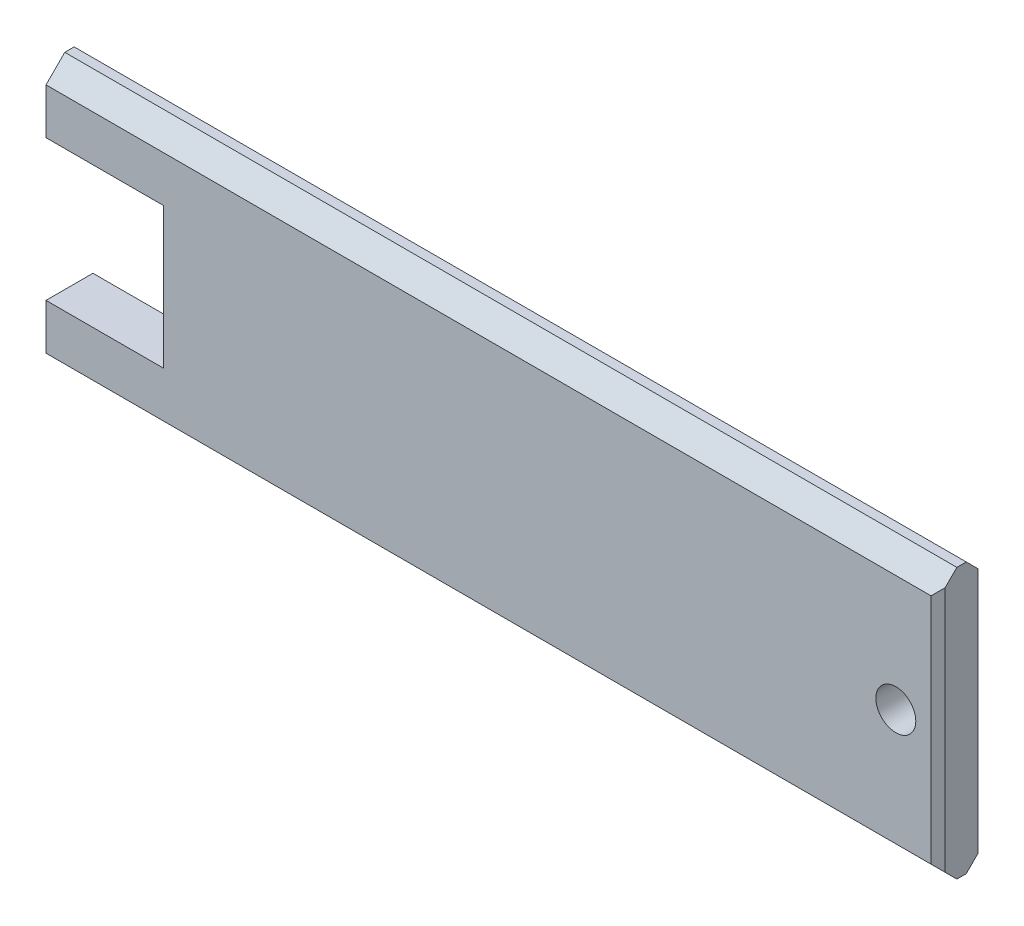
ISO-10303-21;
HEADER;
FILE_DESCRIPTION(('STEP AP214'),'2;1');
FILE_NAME('part.step','',(''),(''),'','','');
FILE_SCHEMA(('AUTOMOTIVE_DESIGN { 1 0 10303 214 1 1 1 1 }'));
ENDSEC;
DATA;
#1=APPLICATION_CONTEXT('core data for automotive mechanical design processes');
#2=APPLICATION_PROTOCOL_DEFINITION('international standard','automotive_design',2000,#1);
#3=PRODUCT_CONTEXT('',#1,'mechanical');
#4=PRODUCT('Part','Part','',(#3));
#5=PRODUCT_RELATED_PRODUCT_CATEGORY('part','',(#4));
#6=PRODUCT_DEFINITION_FORMATION('','',#4);
#7=PRODUCT_DEFINITION_CONTEXT('part definition',#1,'design');
#8=PRODUCT_DEFINITION('design','',#6,#7);
#9=PRODUCT_DEFINITION_SHAPE('','',#8);
#10=(LENGTH_UNIT() NAMED_UNIT(*) SI_UNIT(.MILLI.,.METRE.));
#11=(NAMED_UNIT(*) PLANE_ANGLE_UNIT() SI_UNIT($,.RADIAN.));
#12=(NAMED_UNIT(*) SI_UNIT($,.STERADIAN.) SOLID_ANGLE_UNIT());
#13=UNCERTAINTY_MEASURE_WITH_UNIT(LENGTH_MEASURE(1.E-05),#10,'distance_accuracy_value','');
#14=(GEOMETRIC_REPRESENTATION_CONTEXT(3) GLOBAL_UNCERTAINTY_ASSIGNED_CONTEXT((#13)) GLOBAL_UNIT_ASSIGNED_CONTEXT((#10,
#11,#12)) REPRESENTATION_CONTEXT('',''));
#15=CARTESIAN_POINT('',(0.,0.,0.));
#16=DIRECTION('',(0.,0.,1.));
#17=DIRECTION('',(1.,0.,0.));
#18=AXIS2_PLACEMENT_3D('',#15,#16,#17);
#19=CARTESIAN_POINT('',(-190.,57.5,20.));
#20=DIRECTION('',(1.,0.,0.));
#21=DIRECTION('',(0.,1.,0.));
#22=AXIS2_PLACEMENT_3D('',#19,#20,#21);
#23=PLANE('',#22);
#24=DIRECTION('',(0.,-1.,0.));
#25=VECTOR('',#24,1.);
#26=CARTESIAN_POINT('',(-190.,57.5,20.));
#27=LINE('',#26,#25);
#28=CARTESIAN_POINT('',(-190.,49.5,20.));
#29=VERTEX_POINT('',#28);
#30=CARTESIAN_POINT('',(-190.,30.,20.));
#31=VERTEX_POINT('',#30);
#32=EDGE_CURVE('E168',#29,#31,#27,.T.);
#33=ORIENTED_EDGE('',*,*,#32,.F.);
#34=DIRECTION('',(0.,0.707106781186548,-0.707106781186548));
#35=VECTOR('',#34,1.);
#36=CARTESIAN_POINT('',(-190.,49.5,20.));
#37=LINE('',#36,#35);
#38=CARTESIAN_POINT('',(-190.,57.5,12.));
#39=VERTEX_POINT('',#38);
#40=EDGE_CURVE('E200',#29,#39,#37,.T.);
#41=ORIENTED_EDGE('',*,*,#40,.T.);
#42=DIRECTION('',(0.,0.,-1.));
#43=VECTOR('',#42,1.);
#44=CARTESIAN_POINT('',(-190.,57.5,20.));
#45=LINE('',#44,#43);
#46=CARTESIAN_POINT('',(-190.,57.5,8.00000000000006));
#47=VERTEX_POINT('',#46);
#48=EDGE_CURVE('E175',#39,#47,#45,.T.);
#49=ORIENTED_EDGE('',*,*,#48,.T.);
#50=DIRECTION('',(0.,0.70710678118655,0.707106781186545));
#51=VECTOR('',#50,1.);
#52=CARTESIAN_POINT('',(-190.,57.5,8.00000000000006));
#53=LINE('',#52,#51);
#54=CARTESIAN_POINT('',(-190.,49.4999999999999,0.));
#55=VERTEX_POINT('',#54);
#56=EDGE_CURVE('E198',#47,#55,#53,.F.);
#57=ORIENTED_EDGE('',*,*,#56,.T.);
#58=DIRECTION('',(0.,-1.,0.));
#59=VECTOR('',#58,1.);
#60=CARTESIAN_POINT('',(-190.,57.5,0.));
#61=LINE('',#60,#59);
#62=CARTESIAN_POINT('',(-190.,30.,0.));
#63=VERTEX_POINT('',#62);
#64=EDGE_CURVE('E160',#55,#63,#61,.T.);
#65=ORIENTED_EDGE('',*,*,#64,.T.);
#66=DIRECTION('',(0.,0.,1.));
#67=VECTOR('',#66,1.);
#68=CARTESIAN_POINT('',(-190.,30.,0.));
#69=LINE('',#68,#67);
#70=EDGE_CURVE('E258',#63,#31,#69,.T.);
#71=ORIENTED_EDGE('',*,*,#70,.T.);
#72=EDGE_LOOP('',(#33,#41,#49,#57,#65,#71));
#73=FACE_BOUND('',#72,.T.);
#74=ADVANCED_FACE('F34',(#73),#23,.F.);
#75=CARTESIAN_POINT('',(190.,57.5,20.));
#76=DIRECTION('',(-1.,0.,0.));
#77=DIRECTION('',(0.,-1.,0.));
#78=AXIS2_PLACEMENT_3D('',#75,#76,#77);
#79=PLANE('',#78);
#80=DIRECTION('',(0.,0.,-1.));
#81=VECTOR('',#80,1.);
#82=CARTESIAN_POINT('',(190.,57.5,20.));
#83=LINE('',#82,#81);
#84=CARTESIAN_POINT('',(190.,57.5,12.));
#85=VERTEX_POINT('',#84);
#86=CARTESIAN_POINT('',(190.,57.5,8.00000000000006));
#87=VERTEX_POINT('',#86);
#88=EDGE_CURVE('E178',#85,#87,#83,.T.);
#89=ORIENTED_EDGE('',*,*,#88,.F.);
#90=DIRECTION('',(0.,-0.707106781186548,0.707106781186548));
#91=VECTOR('',#90,1.);
#92=CARTESIAN_POINT('',(190.,49.5,20.));
#93=LINE('',#92,#91);
#94=CARTESIAN_POINT('',(190.,52.5,17.));
#95=VERTEX_POINT('',#94);
#96=EDGE_CURVE('E213',#85,#95,#93,.T.);
#97=ORIENTED_EDGE('',*,*,#96,.T.);
#98=DIRECTION('',(0.,-1.,0.));
#99=VECTOR('',#98,1.);
#100=CARTESIAN_POINT('',(190.,-57.5,17.));
#101=LINE('',#100,#99);
#102=CARTESIAN_POINT('',(190.,-52.4999999999999,17.));
#103=VERTEX_POINT('',#102);
#104=EDGE_CURVE('E181',#95,#103,#101,.T.);
#105=ORIENTED_EDGE('',*,*,#104,.T.);
#106=DIRECTION('',(0.,-0.707106781186545,-0.70710678118655));
#107=VECTOR('',#106,1.);
#108=CARTESIAN_POINT('',(190.,-49.4999999999999,20.));
#109=LINE('',#108,#107);
#110=CARTESIAN_POINT('',(190.,-57.5,11.9999999999999));
#111=VERTEX_POINT('',#110);
#112=EDGE_CURVE('E207',#103,#111,#109,.T.);
#113=ORIENTED_EDGE('',*,*,#112,.T.);
#114=DIRECTION('',(0.,0.,-1.));
#115=VECTOR('',#114,1.);
#116=CARTESIAN_POINT('',(190.,-57.5,20.));
#117=LINE('',#116,#115);
#118=CARTESIAN_POINT('',(190.,-57.5,8.00000000000006));
#119=VERTEX_POINT('',#118);
#120=EDGE_CURVE('E170',#111,#119,#117,.T.);
#121=ORIENTED_EDGE('',*,*,#120,.T.);
#122=DIRECTION('',(0.,-0.70710678118655,0.707106781186545));
#123=VECTOR('',#122,1.);
#124=CARTESIAN_POINT('',(190.,-57.4999999999999,8.00000000000002));
#125=LINE('',#124,#123);
#126=CARTESIAN_POINT('',(190.,-52.4999999999999,3.00000000000006));
#127=VERTEX_POINT('',#126);
#128=EDGE_CURVE('E209',#119,#127,#125,.F.);
#129=ORIENTED_EDGE('',*,*,#128,.T.);
#130=DIRECTION('',(0.,1.,0.));
#131=VECTOR('',#130,1.);
#132=CARTESIAN_POINT('',(190.,57.5,3.00000000000006));
#133=LINE('',#132,#131);
#134=CARTESIAN_POINT('',(190.,52.5,3.00000000000006));
#135=VERTEX_POINT('',#134);
#136=EDGE_CURVE('E184',#127,#135,#133,.T.);
#137=ORIENTED_EDGE('',*,*,#136,.T.);
#138=DIRECTION('',(0.,-0.70710678118655,-0.707106781186545));
#139=VECTOR('',#138,1.);
#140=CARTESIAN_POINT('',(190.,57.5000000000001,8.00000000000011));
#141=LINE('',#140,#139);
#142=EDGE_CURVE('E211',#135,#87,#141,.F.);
#143=ORIENTED_EDGE('',*,*,#142,.T.);
#144=EDGE_LOOP('',(#89,#97,#105,#113,#121,#129,#137,#143));
#145=FACE_BOUND('',#144,.T.);
#146=ADVANCED_FACE('F245',(#145),#79,.F.);
#147=CARTESIAN_POINT('',(-190.,57.5,20.));
#148=DIRECTION('',(0.,-1.,0.));
#149=DIRECTION('',(0.,0.,-1.));
#150=AXIS2_PLACEMENT_3D('',#147,#148,#149);
#151=PLANE('',#150);
#152=ORIENTED_EDGE('',*,*,#48,.F.);
#153=DIRECTION('',(1.,0.,0.));
#154=VECTOR('',#153,1.);
#155=CARTESIAN_POINT('',(187.,57.5,12.));
#156=LINE('',#155,#154);
#157=EDGE_CURVE('E205',#39,#85,#156,.T.);
#158=ORIENTED_EDGE('',*,*,#157,.T.);
#159=ORIENTED_EDGE('',*,*,#88,.T.);
#160=DIRECTION('',(-1.,0.,0.));
#161=VECTOR('',#160,1.);
#162=CARTESIAN_POINT('',(-190.,57.5,8.00000000000006));
#163=LINE('',#162,#161);
#164=EDGE_CURVE('E202',#87,#47,#163,.T.);
#165=ORIENTED_EDGE('',*,*,#164,.T.);
#166=EDGE_LOOP('',(#152,#158,#159,#165));
#167=FACE_BOUND('',#166,.T.);
#168=ADVANCED_FACE('F292',(#167),#151,.F.);
#169=CARTESIAN_POINT('',(-190.,-30.,0.));
#170=VERTEX_POINT('',#169);
#171=CARTESIAN_POINT('',(-190.,-49.4999999999999,0.));
#172=VERTEX_POINT('',#171);
#173=EDGE_CURVE('E150',#170,#172,#61,.T.);
#174=ORIENTED_EDGE('',*,*,#173,.T.);
#175=DIRECTION('',(0.,0.70710678118655,-0.707106781186545));
#176=VECTOR('',#175,1.);
#177=CARTESIAN_POINT('',(-190.,-57.5,8.00000000000006));
#178=LINE('',#177,#176);
#179=CARTESIAN_POINT('',(-190.,-57.5,8.00000000000006));
#180=VERTEX_POINT('',#179);
#181=EDGE_CURVE('E11',#172,#180,#178,.F.);
#182=ORIENTED_EDGE('',*,*,#181,.T.);
#183=DIRECTION('',(0.,0.,-1.));
#184=VECTOR('',#183,1.);
#185=CARTESIAN_POINT('',(-190.,-57.5,20.));
#186=LINE('',#185,#184);
#187=CARTESIAN_POINT('',(-190.,-57.5,11.9999999999999));
#188=VERTEX_POINT('',#187);
#189=EDGE_CURVE('E173',#188,#180,#186,.T.);
#190=ORIENTED_EDGE('',*,*,#189,.F.);
#191=DIRECTION('',(0.,0.707106781186545,0.70710678118655));
#192=VECTOR('',#191,1.);
#193=CARTESIAN_POINT('',(-190.,-49.5,20.));
#194=LINE('',#193,#192);
#195=CARTESIAN_POINT('',(-190.,-49.4999999999999,20.));
#196=VERTEX_POINT('',#195);
#197=EDGE_CURVE('E42',#188,#196,#194,.T.);
#198=ORIENTED_EDGE('',*,*,#197,.T.);
#199=CARTESIAN_POINT('',(-190.,-30.,20.));
#200=VERTEX_POINT('',#199);
#201=EDGE_CURVE('E152',#200,#196,#27,.T.);
#202=ORIENTED_EDGE('',*,*,#201,.F.);
#203=DIRECTION('',(0.,0.,1.));
#204=VECTOR('',#203,1.);
#205=CARTESIAN_POINT('',(-190.,-30.,0.));
#206=LINE('',#205,#204);
#207=EDGE_CURVE('E139',#170,#200,#206,.T.);
#208=ORIENTED_EDGE('',*,*,#207,.F.);
#209=EDGE_LOOP('',(#174,#182,#190,#198,#202,#208));
#210=FACE_BOUND('',#209,.T.);
#211=ADVANCED_FACE('F149',(#210),#23,.F.);
#212=CARTESIAN_POINT('',(-190.,-57.5,20.));
#213=DIRECTION('',(0.,1.,0.));
#214=DIRECTION('',(0.,0.,1.));
#215=AXIS2_PLACEMENT_3D('',#212,#213,#214);
#216=PLANE('',#215);
#217=ORIENTED_EDGE('',*,*,#189,.T.);
#218=DIRECTION('',(1.,0.,0.));
#219=VECTOR('',#218,1.);
#220=CARTESIAN_POINT('',(-190.,-57.5,8.00000000000006));
#221=LINE('',#220,#219);
#222=EDGE_CURVE('E227',#180,#119,#221,.T.);
#223=ORIENTED_EDGE('',*,*,#222,.T.);
#224=ORIENTED_EDGE('',*,*,#120,.F.);
#225=DIRECTION('',(-1.,0.,0.));
#226=VECTOR('',#225,1.);
#227=CARTESIAN_POINT('',(-190.,-57.5,11.9999999999999));
#228=LINE('',#227,#226);
#229=EDGE_CURVE('E54',#111,#188,#228,.T.);
#230=ORIENTED_EDGE('',*,*,#229,.T.);
#231=EDGE_LOOP('',(#217,#223,#224,#230));
#232=FACE_BOUND('',#231,.T.);
#233=ADVANCED_FACE('F297',(#232),#216,.F.);
#234=CARTESIAN_POINT('',(0.,0.,20.));
#235=DIRECTION('',(0.,0.,1.));
#236=DIRECTION('',(1.,0.,0.));
#237=AXIS2_PLACEMENT_3D('',#234,#235,#236);
#238=PLANE('',#237);
#239=DIRECTION('',(0.,1.,0.));
#240=VECTOR('',#239,1.);
#241=CARTESIAN_POINT('',(187.,57.5,20.));
#242=LINE('',#241,#240);
#243=CARTESIAN_POINT('',(187.,-49.4999999999999,20.));
#244=VERTEX_POINT('',#243);
#245=CARTESIAN_POINT('',(187.,49.5,20.));
#246=VERTEX_POINT('',#245);
#247=EDGE_CURVE('E189',#244,#246,#242,.T.);
#248=ORIENTED_EDGE('',*,*,#247,.T.);
#249=DIRECTION('',(-1.,0.,0.));
#250=VECTOR('',#249,1.);
#251=CARTESIAN_POINT('',(-190.,49.5,20.));
#252=LINE('',#251,#250);
#253=EDGE_CURVE('E195',#246,#29,#252,.T.);
#254=ORIENTED_EDGE('',*,*,#253,.T.);
#255=ORIENTED_EDGE('',*,*,#32,.T.);
#256=DIRECTION('',(-1.,0.,0.));
#257=VECTOR('',#256,1.);
#258=CARTESIAN_POINT('',(-190.,30.,20.));
#259=LINE('',#258,#257);
#260=CARTESIAN_POINT('',(-140.,30.,20.));
#261=VERTEX_POINT('',#260);
#262=EDGE_CURVE('E146',#261,#31,#259,.T.);
#263=ORIENTED_EDGE('',*,*,#262,.F.);
#264=DIRECTION('',(0.,1.,0.));
#265=VECTOR('',#264,1.);
#266=CARTESIAN_POINT('',(-140.,30.,20.));
#267=LINE('',#266,#265);
#268=CARTESIAN_POINT('',(-140.,-30.,20.));
#269=VERTEX_POINT('',#268);
#270=EDGE_CURVE('E272',#269,#261,#267,.T.);
#271=ORIENTED_EDGE('',*,*,#270,.F.);
#272=DIRECTION('',(1.,0.,0.));
#273=VECTOR('',#272,1.);
#274=CARTESIAN_POINT('',(-190.,-30.,20.));
#275=LINE('',#274,#273);
#276=EDGE_CURVE('E237',#200,#269,#275,.T.);
#277=ORIENTED_EDGE('',*,*,#276,.F.);
#278=ORIENTED_EDGE('',*,*,#201,.T.);
#279=DIRECTION('',(1.,0.,0.));
#280=VECTOR('',#279,1.);
#281=CARTESIAN_POINT('',(187.,-49.4999999999999,20.));
#282=LINE('',#281,#280);
#283=EDGE_CURVE('E192',#196,#244,#282,.T.);
#284=ORIENTED_EDGE('',*,*,#283,.T.);
#285=EDGE_LOOP('',(#248,#254,#255,#263,#271,#277,#278,#284));
#286=FACE_BOUND('',#285,.T.);
#287=CARTESIAN_POINT('',(172.,0.,20.));
#288=DIRECTION('',(0.,0.,1.));
#289=DIRECTION('',(1.,0.,0.));
#290=AXIS2_PLACEMENT_3D('',#287,#288,#289);
#291=CIRCLE('',#290,8.50000000000001);
#292=CARTESIAN_POINT('',(180.5,0.,20.));
#293=VERTEX_POINT('',#292);
#294=EDGE_CURVE('E164',#293,#293,#291,.T.);
#295=ORIENTED_EDGE('',*,*,#294,.F.);
#296=EDGE_LOOP('',(#295));
#297=FACE_BOUND('',#296,.T.);
#298=ADVANCED_FACE('F233',(#286,#297),#238,.T.);
#299=CARTESIAN_POINT('',(0.,0.,0.));
#300=DIRECTION('',(0.,0.,1.));
#301=DIRECTION('',(1.,0.,0.));
#302=AXIS2_PLACEMENT_3D('',#299,#300,#301);
#303=PLANE('',#302);
#304=CARTESIAN_POINT('',(172.,0.,0.));
#305=DIRECTION('',(0.,0.,1.));
#306=DIRECTION('',(1.,0.,0.));
#307=AXIS2_PLACEMENT_3D('',#304,#305,#306);
#308=CIRCLE('',#307,8.50000000000001);
#309=CARTESIAN_POINT('',(180.5,0.,0.));
#310=VERTEX_POINT('',#309);
#311=EDGE_CURVE('E161',#310,#310,#308,.T.);
#312=ORIENTED_EDGE('',*,*,#311,.T.);
#313=EDGE_LOOP('',(#312));
#314=FACE_BOUND('',#313,.T.);
#315=ORIENTED_EDGE('',*,*,#64,.F.);
#316=DIRECTION('',(1.,0.,0.));
#317=VECTOR('',#316,1.);
#318=CARTESIAN_POINT('',(0.,49.4999999999999,0.));
#319=LINE('',#318,#317);
#320=CARTESIAN_POINT('',(187.,49.4999999999999,0.));
#321=VERTEX_POINT('',#320);
#322=EDGE_CURVE('E220',#55,#321,#319,.T.);
#323=ORIENTED_EDGE('',*,*,#322,.T.);
#324=DIRECTION('',(0.,-1.,0.));
#325=VECTOR('',#324,1.);
#326=CARTESIAN_POINT('',(187.,0.,0.));
#327=LINE('',#326,#325);
#328=CARTESIAN_POINT('',(187.,-49.4999999999999,0.));
#329=VERTEX_POINT('',#328);
#330=EDGE_CURVE('E187',#321,#329,#327,.T.);
#331=ORIENTED_EDGE('',*,*,#330,.T.);
#332=DIRECTION('',(-1.,0.,0.));
#333=VECTOR('',#332,1.);
#334=CARTESIAN_POINT('',(0.,-49.4999999999999,0.));
#335=LINE('',#334,#333);
#336=EDGE_CURVE('E159',#329,#172,#335,.T.);
#337=ORIENTED_EDGE('',*,*,#336,.T.);
#338=ORIENTED_EDGE('',*,*,#173,.F.);
#339=DIRECTION('',(1.,0.,0.));
#340=VECTOR('',#339,1.);
#341=CARTESIAN_POINT('',(-190.,-30.,0.));
#342=LINE('',#341,#340);
#343=CARTESIAN_POINT('',(-140.,-30.,0.));
#344=VERTEX_POINT('',#343);
#345=EDGE_CURVE('E135',#170,#344,#342,.T.);
#346=ORIENTED_EDGE('',*,*,#345,.T.);
#347=DIRECTION('',(0.,1.,0.));
#348=VECTOR('',#347,1.);
#349=CARTESIAN_POINT('',(-140.,30.,0.));
#350=LINE('',#349,#348);
#351=CARTESIAN_POINT('',(-140.,30.,0.));
#352=VERTEX_POINT('',#351);
#353=EDGE_CURVE('E145',#344,#352,#350,.T.);
#354=ORIENTED_EDGE('',*,*,#353,.T.);
#355=DIRECTION('',(-1.,0.,0.));
#356=VECTOR('',#355,1.);
#357=CARTESIAN_POINT('',(-190.,30.,0.));
#358=LINE('',#357,#356);
#359=EDGE_CURVE('E153',#352,#63,#358,.T.);
#360=ORIENTED_EDGE('',*,*,#359,.T.);
#361=EDGE_LOOP('',(#315,#323,#331,#337,#338,#346,#354,#360));
#362=FACE_BOUND('',#361,.T.);
#363=ADVANCED_FACE('F156',(#314,#362),#303,.F.);
#364=CARTESIAN_POINT('',(172.,0.,0.));
#365=DIRECTION('',(0.,0.,1.));
#366=DIRECTION('',(1.,0.,0.));
#367=AXIS2_PLACEMENT_3D('',#364,#365,#366);
#368=CYLINDRICAL_SURFACE('',#367,8.50000000000001);
#369=ORIENTED_EDGE('',*,*,#311,.F.);
#370=EDGE_LOOP('',(#369));
#371=FACE_BOUND('',#370,.T.);
#372=ORIENTED_EDGE('',*,*,#294,.T.);
#373=EDGE_LOOP('',(#372));
#374=FACE_BOUND('',#373,.T.);
#375=ADVANCED_FACE('F307',(#371,#374),#368,.F.);
#376=CARTESIAN_POINT('',(190.,57.5,3.00000000000006));
#377=DIRECTION('',(-0.707106781186556,0.,0.707106781186539));
#378=DIRECTION('',(0.,1.,0.));
#379=AXIS2_PLACEMENT_3D('',#376,#377,#378);
#380=PLANE('',#379);
#381=ORIENTED_EDGE('',*,*,#330,.F.);
#382=DIRECTION('',(0.577350269189615,0.577350269189633,0.577350269189629));
#383=VECTOR('',#382,1.);
#384=CARTESIAN_POINT('',(191.666666666667,54.1666666666667,4.66666666666677));
#385=LINE('',#384,#383);
#386=EDGE_CURVE('E224',#321,#135,#385,.T.);
#387=ORIENTED_EDGE('',*,*,#386,.T.);
#388=ORIENTED_EDGE('',*,*,#136,.F.);
#389=DIRECTION('',(-0.577350269189616,0.577350269189633,-0.577350269189629));
#390=VECTOR('',#389,1.);
#391=CARTESIAN_POINT('',(153.333333333333,-15.8333333333324,-33.6666666666672));
#392=LINE('',#391,#390);
#393=EDGE_CURVE('E222',#127,#329,#392,.T.);
#394=ORIENTED_EDGE('',*,*,#393,.T.);
#395=EDGE_LOOP('',(#381,#387,#388,#394));
#396=FACE_BOUND('',#395,.T.);
#397=ADVANCED_FACE('F285',(#396),#380,.F.);
#398=CARTESIAN_POINT('',(187.,0.,20.));
#399=DIRECTION('',(0.707106781186549,0.,0.707106781186546));
#400=DIRECTION('',(0.,-1.,0.));
#401=AXIS2_PLACEMENT_3D('',#398,#399,#400);
#402=PLANE('',#401);
#403=ORIENTED_EDGE('',*,*,#104,.F.);
#404=DIRECTION('',(-0.577350269189624,-0.577350269189627,0.577350269189627));
#405=VECTOR('',#404,1.);
#406=CARTESIAN_POINT('',(170.5,33.,36.5));
#407=LINE('',#406,#405);
#408=EDGE_CURVE('E217',#95,#246,#407,.T.);
#409=ORIENTED_EDGE('',*,*,#408,.T.);
#410=ORIENTED_EDGE('',*,*,#247,.F.);
#411=DIRECTION('',(0.577350269189625,-0.577350269189624,-0.577350269189628));
#412=VECTOR('',#411,1.);
#413=CARTESIAN_POINT('',(170.5,-33.,36.5));
#414=LINE('',#413,#412);
#415=EDGE_CURVE('E215',#244,#103,#414,.T.);
#416=ORIENTED_EDGE('',*,*,#415,.T.);
#417=EDGE_LOOP('',(#403,#409,#410,#416));
#418=FACE_BOUND('',#417,.T.);
#419=ADVANCED_FACE('F241',(#418),#402,.T.);
#420=CARTESIAN_POINT('',(-190.,30.,0.));
#421=DIRECTION('',(0.,1.,0.));
#422=DIRECTION('',(0.,0.,1.));
#423=AXIS2_PLACEMENT_3D('',#420,#421,#422);
#424=PLANE('',#423);
#425=ORIENTED_EDGE('',*,*,#262,.T.);
#426=ORIENTED_EDGE('',*,*,#70,.F.);
#427=ORIENTED_EDGE('',*,*,#359,.F.);
#428=DIRECTION('',(0.,0.,1.));
#429=VECTOR('',#428,1.);
#430=CARTESIAN_POINT('',(-140.,30.,0.));
#431=LINE('',#430,#429);
#432=EDGE_CURVE('E262',#352,#261,#431,.T.);
#433=ORIENTED_EDGE('',*,*,#432,.T.);
#434=EDGE_LOOP('',(#425,#426,#427,#433));
#435=FACE_BOUND('',#434,.T.);
#436=ADVANCED_FACE('F277',(#435),#424,.F.);
#437=CARTESIAN_POINT('',(-140.,30.,0.));
#438=DIRECTION('',(1.,0.,0.));
#439=DIRECTION('',(0.,0.,-1.));
#440=AXIS2_PLACEMENT_3D('',#437,#438,#439);
#441=PLANE('',#440);
#442=ORIENTED_EDGE('',*,*,#270,.T.);
#443=ORIENTED_EDGE('',*,*,#432,.F.);
#444=ORIENTED_EDGE('',*,*,#353,.F.);
#445=DIRECTION('',(0.,0.,1.));
#446=VECTOR('',#445,1.);
#447=CARTESIAN_POINT('',(-140.,-30.,0.));
#448=LINE('',#447,#446);
#449=EDGE_CURVE('E141',#344,#269,#448,.T.);
#450=ORIENTED_EDGE('',*,*,#449,.T.);
#451=EDGE_LOOP('',(#442,#443,#444,#450));
#452=FACE_BOUND('',#451,.T.);
#453=ADVANCED_FACE('F271',(#452),#441,.F.);
#454=CARTESIAN_POINT('',(-190.,-30.,0.));
#455=DIRECTION('',(0.,-1.,0.));
#456=DIRECTION('',(0.,0.,-1.));
#457=AXIS2_PLACEMENT_3D('',#454,#455,#456);
#458=PLANE('',#457);
#459=ORIENTED_EDGE('',*,*,#276,.T.);
#460=ORIENTED_EDGE('',*,*,#449,.F.);
#461=ORIENTED_EDGE('',*,*,#345,.F.);
#462=ORIENTED_EDGE('',*,*,#207,.T.);
#463=EDGE_LOOP('',(#459,#460,#461,#462));
#464=FACE_BOUND('',#463,.T.);
#465=ADVANCED_FACE('F138',(#464),#458,.F.);
#466=CARTESIAN_POINT('',(0.,49.5,20.));
#467=DIRECTION('',(0.,0.707106781186547,0.707106781186547));
#468=DIRECTION('',(1.,0.,0.));
#469=AXIS2_PLACEMENT_3D('',#466,#467,#468);
#470=PLANE('',#469);
#471=ORIENTED_EDGE('',*,*,#96,.F.);
#472=ORIENTED_EDGE('',*,*,#157,.F.);
#473=ORIENTED_EDGE('',*,*,#40,.F.);
#474=ORIENTED_EDGE('',*,*,#253,.F.);
#475=ORIENTED_EDGE('',*,*,#408,.F.);
#476=EDGE_LOOP('',(#471,#472,#473,#474,#475));
#477=FACE_BOUND('',#476,.T.);
#478=ADVANCED_FACE('F249',(#477),#470,.T.);
#479=CARTESIAN_POINT('',(-190.,57.5,8.00000000000006));
#480=DIRECTION('',(0.,-0.707106781186545,0.70710678118655));
#481=DIRECTION('',(-1.,0.,0.));
#482=AXIS2_PLACEMENT_3D('',#479,#480,#481);
#483=PLANE('',#482);
#484=ORIENTED_EDGE('',*,*,#386,.F.);
#485=ORIENTED_EDGE('',*,*,#322,.F.);
#486=ORIENTED_EDGE('',*,*,#56,.F.);
#487=ORIENTED_EDGE('',*,*,#164,.F.);
#488=ORIENTED_EDGE('',*,*,#142,.F.);
#489=EDGE_LOOP('',(#484,#485,#486,#487,#488));
#490=FACE_BOUND('',#489,.T.);
#491=ADVANCED_FACE('F312',(#490),#483,.F.);
#492=CARTESIAN_POINT('',(-190.,-57.5,8.00000000000006));
#493=DIRECTION('',(0.,0.707106781186545,0.70710678118655));
#494=DIRECTION('',(1.,0.,0.));
#495=AXIS2_PLACEMENT_3D('',#492,#493,#494);
#496=PLANE('',#495);
#497=ORIENTED_EDGE('',*,*,#181,.F.);
#498=ORIENTED_EDGE('',*,*,#336,.F.);
#499=ORIENTED_EDGE('',*,*,#393,.F.);
#500=ORIENTED_EDGE('',*,*,#128,.F.);
#501=ORIENTED_EDGE('',*,*,#222,.F.);
#502=EDGE_LOOP('',(#497,#498,#499,#500,#501));
#503=FACE_BOUND('',#502,.T.);
#504=ADVANCED_FACE('F314',(#503),#496,.F.);
#505=CARTESIAN_POINT('',(0.,-49.4999999999999,20.));
#506=DIRECTION('',(0.,-0.70710678118655,0.707106781186545));
#507=DIRECTION('',(-1.,0.,0.));
#508=AXIS2_PLACEMENT_3D('',#505,#506,#507);
#509=PLANE('',#508);
#510=ORIENTED_EDGE('',*,*,#197,.F.);
#511=ORIENTED_EDGE('',*,*,#229,.F.);
#512=ORIENTED_EDGE('',*,*,#112,.F.);
#513=ORIENTED_EDGE('',*,*,#415,.F.);
#514=ORIENTED_EDGE('',*,*,#283,.F.);
#515=EDGE_LOOP('',(#510,#511,#512,#513,#514));
#516=FACE_BOUND('',#515,.T.);
#517=ADVANCED_FACE('F36',(#516),#509,.T.);
#518=CLOSED_SHELL('',(#74,#146,#168,#211,#233,#298,#363,#375,#397,#419,#436,#453,#465,#478,#491,
#504,#517));
#519=MANIFOLD_SOLID_BREP('B2',#518);
#520=ADVANCED_BREP_SHAPE_REPRESENTATION('',(#18,#519),#14);
#521=SHAPE_DEFINITION_REPRESENTATION(#9,#520);
ENDSEC;
END-ISO-10303-21;
